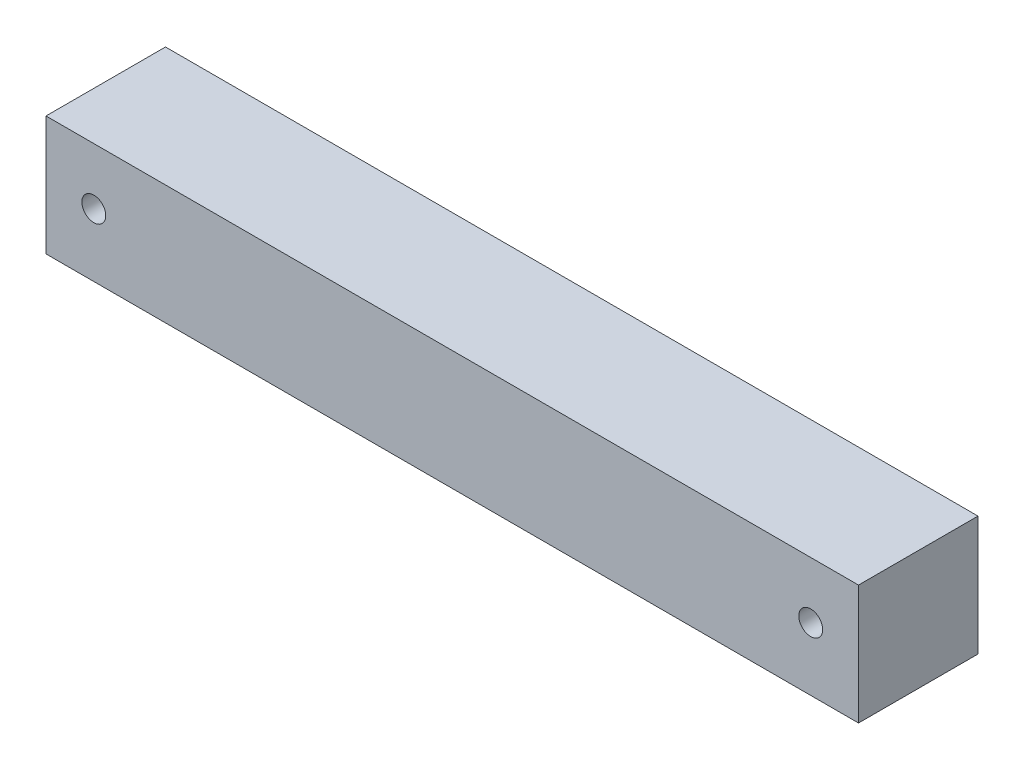
ISO-10303-21;
HEADER;
FILE_DESCRIPTION(('STEP AP214'),'2;1');
FILE_NAME('part.step','',(''),(''),'','','');
FILE_SCHEMA(('AUTOMOTIVE_DESIGN { 1 0 10303 214 1 1 1 1 }'));
ENDSEC;
DATA;
#1=APPLICATION_CONTEXT('core data for automotive mechanical design processes');
#2=APPLICATION_PROTOCOL_DEFINITION('international standard','automotive_design',2000,#1);
#3=PRODUCT_CONTEXT('',#1,'mechanical');
#4=PRODUCT('Part','Part','',(#3));
#5=PRODUCT_RELATED_PRODUCT_CATEGORY('part','',(#4));
#6=PRODUCT_DEFINITION_FORMATION('','',#4);
#7=PRODUCT_DEFINITION_CONTEXT('part definition',#1,'design');
#8=PRODUCT_DEFINITION('design','',#6,#7);
#9=PRODUCT_DEFINITION_SHAPE('','',#8);
#10=(LENGTH_UNIT() NAMED_UNIT(*) SI_UNIT(.MILLI.,.METRE.));
#11=(NAMED_UNIT(*) PLANE_ANGLE_UNIT() SI_UNIT($,.RADIAN.));
#12=(NAMED_UNIT(*) SI_UNIT($,.STERADIAN.) SOLID_ANGLE_UNIT());
#13=UNCERTAINTY_MEASURE_WITH_UNIT(LENGTH_MEASURE(1.E-05),#10,'distance_accuracy_value','');
#14=(GEOMETRIC_REPRESENTATION_CONTEXT(3) GLOBAL_UNCERTAINTY_ASSIGNED_CONTEXT((#13)) GLOBAL_UNIT_ASSIGNED_CONTEXT((#10,
#11,#12)) REPRESENTATION_CONTEXT('',''));
#15=CARTESIAN_POINT('',(0.,0.,0.));
#16=DIRECTION('',(0.,0.,1.));
#17=DIRECTION('',(1.,0.,0.));
#18=AXIS2_PLACEMENT_3D('',#15,#16,#17);
#19=CARTESIAN_POINT('',(-19.0580741392801,11.2859154929577,10.));
#20=DIRECTION('',(0.,0.,1.));
#21=DIRECTION('',(1.,0.,0.));
#22=AXIS2_PLACEMENT_3D('',#19,#20,#21);
#23=PLANE('',#22);
#24=CARTESIAN_POINT('',(44.9419258607199,16.5535520346232,10.));
#25=DIRECTION('',(0.,0.,1.));
#26=DIRECTION('',(1.,0.,0.));
#27=AXIS2_PLACEMENT_3D('',#24,#25,#26);
#28=CIRCLE('',#27,0.999999999999998);
#29=CARTESIAN_POINT('',(45.9419258607199,16.5535520346232,10.));
#30=VERTEX_POINT('',#29);
#31=EDGE_CURVE('E99',#30,#30,#28,.T.);
#32=ORIENTED_EDGE('',*,*,#31,.F.);
#33=EDGE_LOOP('',(#32));
#34=FACE_BOUND('',#33,.T.);
#35=DIRECTION('',(0.,-1.,0.));
#36=VECTOR('',#35,1.);
#37=CARTESIAN_POINT('',(-19.0580741392801,21.2859154929577,10.));
#38=LINE('',#37,#36);
#39=CARTESIAN_POINT('',(-19.0580741392801,21.2859154929577,10.));
#40=VERTEX_POINT('',#39);
#41=CARTESIAN_POINT('',(-19.0580741392801,11.2859154929577,10.));
#42=VERTEX_POINT('',#41);
#43=EDGE_CURVE('E84',#40,#42,#38,.T.);
#44=ORIENTED_EDGE('',*,*,#43,.T.);
#45=DIRECTION('',(1.,0.,0.));
#46=VECTOR('',#45,1.);
#47=CARTESIAN_POINT('',(-19.0580741392801,11.2859154929577,10.));
#48=LINE('',#47,#46);
#49=CARTESIAN_POINT('',(48.9419258607199,11.2859154929577,10.));
#50=VERTEX_POINT('',#49);
#51=EDGE_CURVE('E79',#42,#50,#48,.T.);
#52=ORIENTED_EDGE('',*,*,#51,.T.);
#53=DIRECTION('',(0.,1.,0.));
#54=VECTOR('',#53,1.);
#55=CARTESIAN_POINT('',(48.9419258607199,21.2859154929577,10.));
#56=LINE('',#55,#54);
#57=CARTESIAN_POINT('',(48.9419258607199,21.2859154929577,10.));
#58=VERTEX_POINT('',#57);
#59=EDGE_CURVE('E82',#50,#58,#56,.T.);
#60=ORIENTED_EDGE('',*,*,#59,.T.);
#61=DIRECTION('',(-1.,0.,0.));
#62=VECTOR('',#61,1.);
#63=CARTESIAN_POINT('',(-19.0580741392801,21.2859154929577,10.));
#64=LINE('',#63,#62);
#65=EDGE_CURVE('E49',#58,#40,#64,.T.);
#66=ORIENTED_EDGE('',*,*,#65,.T.);
#67=EDGE_LOOP('',(#44,#52,#60,#66));
#68=FACE_BOUND('',#67,.T.);
#69=CARTESIAN_POINT('',(-15.0580741392801,16.5535520346232,10.));
#70=DIRECTION('',(0.,0.,1.));
#71=DIRECTION('',(1.,0.,0.));
#72=AXIS2_PLACEMENT_3D('',#69,#70,#71);
#73=CIRCLE('',#72,1.);
#74=CARTESIAN_POINT('',(-14.0580741392801,16.5535520346232,10.));
#75=VERTEX_POINT('',#74);
#76=EDGE_CURVE('E114',#75,#75,#73,.T.);
#77=ORIENTED_EDGE('',*,*,#76,.F.);
#78=EDGE_LOOP('',(#77));
#79=FACE_BOUND('',#78,.T.);
#80=ADVANCED_FACE('F32',(#34,#68,#79),#23,.T.);
#81=CARTESIAN_POINT('',(-19.0580741392801,11.2859154929577,0.));
#82=DIRECTION('',(0.,0.,1.));
#83=DIRECTION('',(1.,0.,0.));
#84=AXIS2_PLACEMENT_3D('',#81,#82,#83);
#85=PLANE('',#84);
#86=CARTESIAN_POINT('',(44.9419258607199,16.5535520346232,0.));
#87=DIRECTION('',(0.,0.,1.));
#88=DIRECTION('',(1.,0.,0.));
#89=AXIS2_PLACEMENT_3D('',#86,#87,#88);
#90=CIRCLE('',#89,0.999999999999998);
#91=CARTESIAN_POINT('',(45.9419258607199,16.5535520346232,0.));
#92=VERTEX_POINT('',#91);
#93=EDGE_CURVE('E111',#92,#92,#90,.T.);
#94=ORIENTED_EDGE('',*,*,#93,.T.);
#95=EDGE_LOOP('',(#94));
#96=FACE_BOUND('',#95,.T.);
#97=DIRECTION('',(0.,-1.,0.));
#98=VECTOR('',#97,1.);
#99=CARTESIAN_POINT('',(-19.0580741392801,21.2859154929577,0.));
#100=LINE('',#99,#98);
#101=CARTESIAN_POINT('',(-19.0580741392801,21.2859154929577,0.));
#102=VERTEX_POINT('',#101);
#103=CARTESIAN_POINT('',(-19.0580741392801,11.2859154929577,0.));
#104=VERTEX_POINT('',#103);
#105=EDGE_CURVE('E96',#102,#104,#100,.T.);
#106=ORIENTED_EDGE('',*,*,#105,.F.);
#107=DIRECTION('',(-1.,0.,0.));
#108=VECTOR('',#107,1.);
#109=CARTESIAN_POINT('',(-19.0580741392801,21.2859154929577,0.));
#110=LINE('',#109,#108);
#111=CARTESIAN_POINT('',(48.9419258607199,21.2859154929577,0.));
#112=VERTEX_POINT('',#111);
#113=EDGE_CURVE('E72',#112,#102,#110,.T.);
#114=ORIENTED_EDGE('',*,*,#113,.F.);
#115=DIRECTION('',(0.,1.,0.));
#116=VECTOR('',#115,1.);
#117=CARTESIAN_POINT('',(48.9419258607199,21.2859154929577,0.));
#118=LINE('',#117,#116);
#119=CARTESIAN_POINT('',(48.9419258607199,11.2859154929577,0.));
#120=VERTEX_POINT('',#119);
#121=EDGE_CURVE('E66',#120,#112,#118,.T.);
#122=ORIENTED_EDGE('',*,*,#121,.F.);
#123=DIRECTION('',(1.,0.,0.));
#124=VECTOR('',#123,1.);
#125=CARTESIAN_POINT('',(-19.0580741392801,11.2859154929577,0.));
#126=LINE('',#125,#124);
#127=EDGE_CURVE('E88',#104,#120,#126,.T.);
#128=ORIENTED_EDGE('',*,*,#127,.F.);
#129=EDGE_LOOP('',(#106,#114,#122,#128));
#130=FACE_BOUND('',#129,.T.);
#131=CARTESIAN_POINT('',(-15.0580741392801,16.5535520346232,0.));
#132=DIRECTION('',(0.,0.,1.));
#133=DIRECTION('',(1.,0.,0.));
#134=AXIS2_PLACEMENT_3D('',#131,#132,#133);
#135=CIRCLE('',#134,1.);
#136=CARTESIAN_POINT('',(-14.0580741392801,16.5535520346232,0.));
#137=VERTEX_POINT('',#136);
#138=EDGE_CURVE('E117',#137,#137,#135,.T.);
#139=ORIENTED_EDGE('',*,*,#138,.T.);
#140=EDGE_LOOP('',(#139));
#141=FACE_BOUND('',#140,.T.);
#142=ADVANCED_FACE('F107',(#96,#130,#141),#85,.F.);
#143=CARTESIAN_POINT('',(-19.0580741392801,21.2859154929577,10.));
#144=DIRECTION('',(1.,0.,0.));
#145=DIRECTION('',(0.,0.,-1.));
#146=AXIS2_PLACEMENT_3D('',#143,#144,#145);
#147=PLANE('',#146);
#148=ORIENTED_EDGE('',*,*,#105,.T.);
#149=DIRECTION('',(0.,0.,-1.));
#150=VECTOR('',#149,1.);
#151=CARTESIAN_POINT('',(-19.0580741392801,11.2859154929577,10.));
#152=LINE('',#151,#150);
#153=EDGE_CURVE('E11',#42,#104,#152,.T.);
#154=ORIENTED_EDGE('',*,*,#153,.F.);
#155=ORIENTED_EDGE('',*,*,#43,.F.);
#156=DIRECTION('',(0.,0.,-1.));
#157=VECTOR('',#156,1.);
#158=CARTESIAN_POINT('',(-19.0580741392801,21.2859154929577,10.));
#159=LINE('',#158,#157);
#160=EDGE_CURVE('E92',#40,#102,#159,.T.);
#161=ORIENTED_EDGE('',*,*,#160,.T.);
#162=EDGE_LOOP('',(#148,#154,#155,#161));
#163=FACE_BOUND('',#162,.T.);
#164=ADVANCED_FACE('F34',(#163),#147,.F.);
#165=CARTESIAN_POINT('',(-19.0580741392801,11.2859154929577,10.));
#166=DIRECTION('',(0.,1.,0.));
#167=DIRECTION('',(0.,0.,1.));
#168=AXIS2_PLACEMENT_3D('',#165,#166,#167);
#169=PLANE('',#168);
#170=ORIENTED_EDGE('',*,*,#127,.T.);
#171=DIRECTION('',(0.,0.,-1.));
#172=VECTOR('',#171,1.);
#173=CARTESIAN_POINT('',(48.9419258607199,11.2859154929577,10.));
#174=LINE('',#173,#172);
#175=EDGE_CURVE('E41',#50,#120,#174,.T.);
#176=ORIENTED_EDGE('',*,*,#175,.F.);
#177=ORIENTED_EDGE('',*,*,#51,.F.);
#178=ORIENTED_EDGE('',*,*,#153,.T.);
#179=EDGE_LOOP('',(#170,#176,#177,#178));
#180=FACE_BOUND('',#179,.T.);
#181=ADVANCED_FACE('F87',(#180),#169,.F.);
#182=CARTESIAN_POINT('',(48.9419258607199,21.2859154929577,10.));
#183=DIRECTION('',(-1.,0.,0.));
#184=DIRECTION('',(0.,-1.,0.));
#185=AXIS2_PLACEMENT_3D('',#182,#183,#184);
#186=PLANE('',#185);
#187=ORIENTED_EDGE('',*,*,#121,.T.);
#188=DIRECTION('',(0.,0.,-1.));
#189=VECTOR('',#188,1.);
#190=CARTESIAN_POINT('',(48.9419258607199,21.2859154929577,10.));
#191=LINE('',#190,#189);
#192=EDGE_CURVE('E89',#58,#112,#191,.T.);
#193=ORIENTED_EDGE('',*,*,#192,.F.);
#194=ORIENTED_EDGE('',*,*,#59,.F.);
#195=ORIENTED_EDGE('',*,*,#175,.T.);
#196=EDGE_LOOP('',(#187,#193,#194,#195));
#197=FACE_BOUND('',#196,.T.);
#198=ADVANCED_FACE('F90',(#197),#186,.F.);
#199=CARTESIAN_POINT('',(-19.0580741392801,21.2859154929577,10.));
#200=DIRECTION('',(0.,-1.,0.));
#201=DIRECTION('',(0.,0.,-1.));
#202=AXIS2_PLACEMENT_3D('',#199,#200,#201);
#203=PLANE('',#202);
#204=ORIENTED_EDGE('',*,*,#113,.T.);
#205=ORIENTED_EDGE('',*,*,#160,.F.);
#206=ORIENTED_EDGE('',*,*,#65,.F.);
#207=ORIENTED_EDGE('',*,*,#192,.T.);
#208=EDGE_LOOP('',(#204,#205,#206,#207));
#209=FACE_BOUND('',#208,.T.);
#210=ADVANCED_FACE('F104',(#209),#203,.F.);
#211=CARTESIAN_POINT('',(44.9419258607199,16.5535520346232,10.));
#212=DIRECTION('',(0.,0.,-1.));
#213=DIRECTION('',(-1.,0.,0.));
#214=AXIS2_PLACEMENT_3D('',#211,#212,#213);
#215=CYLINDRICAL_SURFACE('',#214,0.999999999999998);
#216=ORIENTED_EDGE('',*,*,#31,.T.);
#217=EDGE_LOOP('',(#216));
#218=FACE_BOUND('',#217,.T.);
#219=ORIENTED_EDGE('',*,*,#93,.F.);
#220=EDGE_LOOP('',(#219));
#221=FACE_BOUND('',#220,.T.);
#222=ADVANCED_FACE('F135',(#218,#221),#215,.F.);
#223=CARTESIAN_POINT('',(-15.0580741392801,16.5535520346232,10.));
#224=DIRECTION('',(0.,0.,-1.));
#225=DIRECTION('',(-1.,0.,0.));
#226=AXIS2_PLACEMENT_3D('',#223,#224,#225);
#227=CYLINDRICAL_SURFACE('',#226,1.);
#228=ORIENTED_EDGE('',*,*,#76,.T.);
#229=EDGE_LOOP('',(#228));
#230=FACE_BOUND('',#229,.T.);
#231=ORIENTED_EDGE('',*,*,#138,.F.);
#232=EDGE_LOOP('',(#231));
#233=FACE_BOUND('',#232,.T.);
#234=ADVANCED_FACE('F123',(#230,#233),#227,.F.);
#235=CLOSED_SHELL('',(#80,#142,#164,#181,#198,#210,#222,#234));
#236=MANIFOLD_SOLID_BREP('B2',#235);
#237=ADVANCED_BREP_SHAPE_REPRESENTATION('',(#18,#236),#14);
#238=SHAPE_DEFINITION_REPRESENTATION(#9,#237);
ENDSEC;
END-ISO-10303-21;
